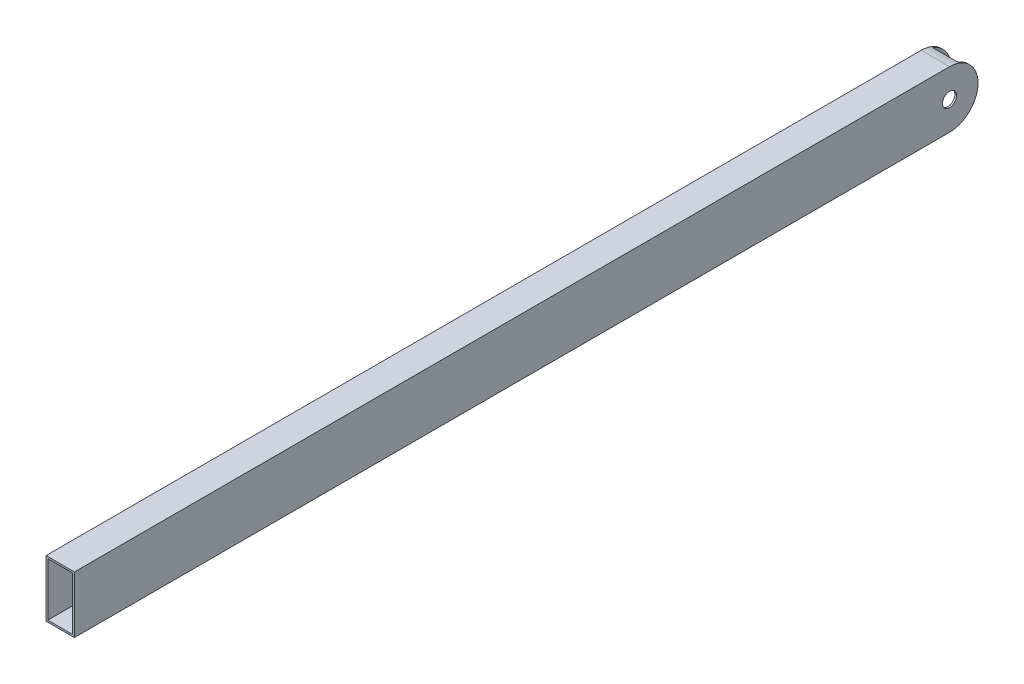
ISO-10303-21;
HEADER;
FILE_DESCRIPTION(('STEP AP214'),'2;1');
FILE_NAME('part.step','',(''),(''),'','','');
FILE_SCHEMA(('AUTOMOTIVE_DESIGN { 1 0 10303 214 1 1 1 1 }'));
ENDSEC;
DATA;
#1=APPLICATION_CONTEXT('core data for automotive mechanical design processes');
#2=APPLICATION_PROTOCOL_DEFINITION('international standard','automotive_design',2000,#1);
#3=PRODUCT_CONTEXT('',#1,'mechanical');
#4=PRODUCT('Part','Part','',(#3));
#5=PRODUCT_RELATED_PRODUCT_CATEGORY('part','',(#4));
#6=PRODUCT_DEFINITION_FORMATION('','',#4);
#7=PRODUCT_DEFINITION_CONTEXT('part definition',#1,'design');
#8=PRODUCT_DEFINITION('design','',#6,#7);
#9=PRODUCT_DEFINITION_SHAPE('','',#8);
#10=(LENGTH_UNIT() NAMED_UNIT(*) SI_UNIT(.MILLI.,.METRE.));
#11=(NAMED_UNIT(*) PLANE_ANGLE_UNIT() SI_UNIT($,.RADIAN.));
#12=(NAMED_UNIT(*) SI_UNIT($,.STERADIAN.) SOLID_ANGLE_UNIT());
#13=UNCERTAINTY_MEASURE_WITH_UNIT(LENGTH_MEASURE(1.E-05),#10,'distance_accuracy_value','');
#14=(GEOMETRIC_REPRESENTATION_CONTEXT(3) GLOBAL_UNCERTAINTY_ASSIGNED_CONTEXT((#13)) GLOBAL_UNIT_ASSIGNED_CONTEXT((#10,
#11,#12)) REPRESENTATION_CONTEXT('',''));
#15=CARTESIAN_POINT('',(0.,0.,0.));
#16=DIRECTION('',(0.,0.,1.));
#17=DIRECTION('',(1.,0.,0.));
#18=AXIS2_PLACEMENT_3D('',#15,#16,#17);
#19=CARTESIAN_POINT('',(12.7,0.,-378.46));
#20=DIRECTION('',(1.,0.,0.));
#21=DIRECTION('',(0.,0.,-1.));
#22=AXIS2_PLACEMENT_3D('',#19,#20,#21);
#23=CYLINDRICAL_SURFACE('',#22,6.35);
#24=CARTESIAN_POINT('',(-11.1125,0.,-378.46));
#25=DIRECTION('',(1.,0.,0.));
#26=DIRECTION('',(0.,0.,-1.));
#27=AXIS2_PLACEMENT_3D('',#24,#25,#26);
#28=CIRCLE('',#27,6.35);
#29=CARTESIAN_POINT('',(-11.1125,0.,-384.81));
#30=VERTEX_POINT('',#29);
#31=EDGE_CURVE('E99',#30,#30,#28,.F.);
#32=ORIENTED_EDGE('',*,*,#31,.F.);
#33=EDGE_LOOP('',(#32));
#34=FACE_BOUND('',#33,.T.);
#35=CARTESIAN_POINT('',(-12.7,0.,-378.46));
#36=DIRECTION('',(1.,0.,0.));
#37=DIRECTION('',(0.,0.,-1.));
#38=AXIS2_PLACEMENT_3D('',#35,#36,#37);
#39=CIRCLE('',#38,6.35);
#40=CARTESIAN_POINT('',(-12.7,0.,-384.81));
#41=VERTEX_POINT('',#40);
#42=EDGE_CURVE('E19',#41,#41,#39,.T.);
#43=ORIENTED_EDGE('',*,*,#42,.F.);
#44=EDGE_LOOP('',(#43));
#45=FACE_BOUND('',#44,.T.);
#46=ADVANCED_FACE('F16',(#34,#45),#23,.F.);
#47=CARTESIAN_POINT('',(-12.7,25.4,-403.86));
#48=DIRECTION('',(-1.,0.,0.));
#49=DIRECTION('',(0.,0.,1.));
#50=AXIS2_PLACEMENT_3D('',#47,#48,#49);
#51=PLANE('',#50);
#52=ORIENTED_EDGE('',*,*,#42,.T.);
#53=EDGE_LOOP('',(#52));
#54=FACE_BOUND('',#53,.T.);
#55=DIRECTION('',(0.,0.,1.));
#56=VECTOR('',#55,1.);
#57=CARTESIAN_POINT('',(-12.7,25.4,-403.86));
#58=LINE('',#57,#56);
#59=CARTESIAN_POINT('',(-12.7,25.4,-378.46));
#60=VERTEX_POINT('',#59);
#61=CARTESIAN_POINT('',(-12.7,25.4,403.86));
#62=VERTEX_POINT('',#61);
#63=EDGE_CURVE('E154',#60,#62,#58,.T.);
#64=ORIENTED_EDGE('',*,*,#63,.F.);
#65=CARTESIAN_POINT('',(-12.7,0.,-378.46));
#66=DIRECTION('',(1.,0.,0.));
#67=DIRECTION('',(0.,0.,-1.));
#68=AXIS2_PLACEMENT_3D('',#65,#66,#67);
#69=CIRCLE('',#68,25.4);
#70=CARTESIAN_POINT('',(-12.7,-25.4,-378.46));
#71=VERTEX_POINT('',#70);
#72=EDGE_CURVE('E64',#71,#60,#69,.T.);
#73=ORIENTED_EDGE('',*,*,#72,.F.);
#74=DIRECTION('',(0.,0.,-1.));
#75=VECTOR('',#74,1.);
#76=CARTESIAN_POINT('',(-12.7,-25.4,-403.86));
#77=LINE('',#76,#75);
#78=CARTESIAN_POINT('',(-12.7,-25.4,403.86));
#79=VERTEX_POINT('',#78);
#80=EDGE_CURVE('E135',#79,#71,#77,.T.);
#81=ORIENTED_EDGE('',*,*,#80,.F.);
#82=DIRECTION('',(0.,1.,0.));
#83=VECTOR('',#82,1.);
#84=CARTESIAN_POINT('',(-12.7,0.,403.86));
#85=LINE('',#84,#83);
#86=EDGE_CURVE('E71',#62,#79,#85,.F.);
#87=ORIENTED_EDGE('',*,*,#86,.F.);
#88=EDGE_LOOP('',(#64,#73,#81,#87));
#89=FACE_BOUND('',#88,.T.);
#90=ADVANCED_FACE('F286',(#54,#89),#51,.T.);
#91=CARTESIAN_POINT('',(-11.1125,23.8125,-403.86));
#92=DIRECTION('',(0.,-1.,0.));
#93=DIRECTION('',(0.,0.,-1.));
#94=AXIS2_PLACEMENT_3D('',#91,#92,#93);
#95=PLANE('',#94);
#96=DIRECTION('',(0.,0.,-1.));
#97=VECTOR('',#96,1.);
#98=CARTESIAN_POINT('',(-11.1125,23.8125,-403.86));
#99=LINE('',#98,#97);
#100=CARTESIAN_POINT('',(-11.1125,23.8124999999871,-387.298825926027));
#101=VERTEX_POINT('',#100);
#102=CARTESIAN_POINT('',(-11.1125,23.8125,403.86));
#103=VERTEX_POINT('',#102);
#104=EDGE_CURVE('E89',#101,#103,#99,.F.);
#105=ORIENTED_EDGE('',*,*,#104,.F.);
#106=DIRECTION('',(1.,0.,0.));
#107=VECTOR('',#106,1.);
#108=CARTESIAN_POINT('',(-45.81144,23.8124999999741,-387.298825926062));
#109=LINE('',#108,#107);
#110=CARTESIAN_POINT('',(11.1125,23.8124999999871,-387.298825926027));
#111=VERTEX_POINT('',#110);
#112=EDGE_CURVE('E133',#111,#101,#109,.F.);
#113=ORIENTED_EDGE('',*,*,#112,.F.);
#114=DIRECTION('',(0.,0.,1.));
#115=VECTOR('',#114,1.);
#116=CARTESIAN_POINT('',(11.1125,23.8125,-403.86));
#117=LINE('',#116,#115);
#118=CARTESIAN_POINT('',(11.1125,23.8125,403.86));
#119=VERTEX_POINT('',#118);
#120=EDGE_CURVE('E105',#119,#111,#117,.F.);
#121=ORIENTED_EDGE('',*,*,#120,.F.);
#122=DIRECTION('',(1.,0.,0.));
#123=VECTOR('',#122,1.);
#124=CARTESIAN_POINT('',(0.,23.8125,403.86));
#125=LINE('',#124,#123);
#126=EDGE_CURVE('E102',#103,#119,#125,.T.);
#127=ORIENTED_EDGE('',*,*,#126,.F.);
#128=EDGE_LOOP('',(#105,#113,#121,#127));
#129=FACE_BOUND('',#128,.T.);
#130=ADVANCED_FACE('F103',(#129),#95,.T.);
#131=CARTESIAN_POINT('',(-11.1125,-23.8125,-403.86));
#132=DIRECTION('',(1.,0.,0.));
#133=DIRECTION('',(0.,0.,-1.));
#134=AXIS2_PLACEMENT_3D('',#131,#132,#133);
#135=PLANE('',#134);
#136=ORIENTED_EDGE('',*,*,#31,.T.);
#137=EDGE_LOOP('',(#136));
#138=FACE_BOUND('',#137,.T.);
#139=DIRECTION('',(0.,0.,1.));
#140=VECTOR('',#139,1.);
#141=CARTESIAN_POINT('',(-11.1125,-23.8125,-403.86));
#142=LINE('',#141,#140);
#143=CARTESIAN_POINT('',(-11.1125,-23.8124999999871,-387.298825926027));
#144=VERTEX_POINT('',#143);
#145=CARTESIAN_POINT('',(-11.1125,-23.8125,403.86));
#146=VERTEX_POINT('',#145);
#147=EDGE_CURVE('E84',#144,#146,#142,.T.);
#148=ORIENTED_EDGE('',*,*,#147,.F.);
#149=CARTESIAN_POINT('',(-11.1125,0.,-378.46));
#150=DIRECTION('',(1.,0.,0.));
#151=DIRECTION('',(0.,0.,-1.));
#152=AXIS2_PLACEMENT_3D('',#149,#150,#151);
#153=CIRCLE('',#152,25.4);
#154=EDGE_CURVE('E96',#101,#144,#153,.F.);
#155=ORIENTED_EDGE('',*,*,#154,.F.);
#156=ORIENTED_EDGE('',*,*,#104,.T.);
#157=DIRECTION('',(0.,1.,0.));
#158=VECTOR('',#157,1.);
#159=CARTESIAN_POINT('',(-11.1125,0.,403.86));
#160=LINE('',#159,#158);
#161=EDGE_CURVE('E93',#146,#103,#160,.T.);
#162=ORIENTED_EDGE('',*,*,#161,.F.);
#163=EDGE_LOOP('',(#148,#155,#156,#162));
#164=FACE_BOUND('',#163,.T.);
#165=ADVANCED_FACE('F91',(#138,#164),#135,.T.);
#166=CARTESIAN_POINT('',(11.1125,-23.8125,-403.86));
#167=DIRECTION('',(0.,1.,0.));
#168=DIRECTION('',(0.,0.,1.));
#169=AXIS2_PLACEMENT_3D('',#166,#167,#168);
#170=PLANE('',#169);
#171=DIRECTION('',(0.,0.,1.));
#172=VECTOR('',#171,1.);
#173=CARTESIAN_POINT('',(11.1125,-23.8125,-403.86));
#174=LINE('',#173,#172);
#175=CARTESIAN_POINT('',(11.1125,-23.8124999999871,-387.298825926027));
#176=VERTEX_POINT('',#175);
#177=CARTESIAN_POINT('',(11.1125,-23.8125,403.86));
#178=VERTEX_POINT('',#177);
#179=EDGE_CURVE('E139',#176,#178,#174,.T.);
#180=ORIENTED_EDGE('',*,*,#179,.F.);
#181=DIRECTION('',(1.,0.,0.));
#182=VECTOR('',#181,1.);
#183=CARTESIAN_POINT('',(-45.81144,-23.8124999999741,-387.298825926062));
#184=LINE('',#183,#182);
#185=EDGE_CURVE('E131',#144,#176,#184,.T.);
#186=ORIENTED_EDGE('',*,*,#185,.F.);
#187=ORIENTED_EDGE('',*,*,#147,.T.);
#188=DIRECTION('',(1.,0.,0.));
#189=VECTOR('',#188,1.);
#190=CARTESIAN_POINT('',(0.,-23.8125,403.86));
#191=LINE('',#190,#189);
#192=EDGE_CURVE('E112',#178,#146,#191,.F.);
#193=ORIENTED_EDGE('',*,*,#192,.F.);
#194=EDGE_LOOP('',(#180,#186,#187,#193));
#195=FACE_BOUND('',#194,.T.);
#196=ADVANCED_FACE('F190',(#195),#170,.T.);
#197=CARTESIAN_POINT('',(11.1125,23.8125,-403.86));
#198=DIRECTION('',(-1.,0.,0.));
#199=DIRECTION('',(0.,0.,1.));
#200=AXIS2_PLACEMENT_3D('',#197,#198,#199);
#201=PLANE('',#200);
#202=CARTESIAN_POINT('',(11.1125,0.,-378.46));
#203=DIRECTION('',(1.,0.,0.));
#204=DIRECTION('',(0.,0.,-1.));
#205=AXIS2_PLACEMENT_3D('',#202,#203,#204);
#206=CIRCLE('',#205,6.35);
#207=CARTESIAN_POINT('',(11.1125,0.,-384.81));
#208=VERTEX_POINT('',#207);
#209=EDGE_CURVE('E124',#208,#208,#206,.T.);
#210=ORIENTED_EDGE('',*,*,#209,.T.);
#211=EDGE_LOOP('',(#210));
#212=FACE_BOUND('',#211,.T.);
#213=ORIENTED_EDGE('',*,*,#120,.T.);
#214=CARTESIAN_POINT('',(11.1125,0.,-378.46));
#215=DIRECTION('',(1.,0.,0.));
#216=DIRECTION('',(0.,0.,-1.));
#217=AXIS2_PLACEMENT_3D('',#214,#215,#216);
#218=CIRCLE('',#217,25.4);
#219=EDGE_CURVE('E128',#176,#111,#218,.T.);
#220=ORIENTED_EDGE('',*,*,#219,.F.);
#221=ORIENTED_EDGE('',*,*,#179,.T.);
#222=DIRECTION('',(0.,1.,0.));
#223=VECTOR('',#222,1.);
#224=CARTESIAN_POINT('',(11.1125,0.,403.86));
#225=LINE('',#224,#223);
#226=EDGE_CURVE('E109',#119,#178,#225,.F.);
#227=ORIENTED_EDGE('',*,*,#226,.F.);
#228=EDGE_LOOP('',(#213,#220,#221,#227));
#229=FACE_BOUND('',#228,.T.);
#230=ADVANCED_FACE('F192',(#212,#229),#201,.T.);
#231=CARTESIAN_POINT('',(12.7,25.4,-403.86));
#232=DIRECTION('',(0.,1.,0.));
#233=DIRECTION('',(0.,0.,1.));
#234=AXIS2_PLACEMENT_3D('',#231,#232,#233);
#235=PLANE('',#234);
#236=DIRECTION('',(0.,0.,-1.));
#237=VECTOR('',#236,1.);
#238=CARTESIAN_POINT('',(12.7,25.4,-403.86));
#239=LINE('',#238,#237);
#240=CARTESIAN_POINT('',(12.7,25.4,-378.46));
#241=VERTEX_POINT('',#240);
#242=CARTESIAN_POINT('',(12.7,25.4,403.86));
#243=VERTEX_POINT('',#242);
#244=EDGE_CURVE('E127',#241,#243,#239,.F.);
#245=ORIENTED_EDGE('',*,*,#244,.F.);
#246=DIRECTION('',(1.,0.,0.));
#247=VECTOR('',#246,1.);
#248=CARTESIAN_POINT('',(-45.81144,25.4,-378.46));
#249=LINE('',#248,#247);
#250=EDGE_CURVE('E134',#60,#241,#249,.T.);
#251=ORIENTED_EDGE('',*,*,#250,.F.);
#252=ORIENTED_EDGE('',*,*,#63,.T.);
#253=DIRECTION('',(1.,0.,0.));
#254=VECTOR('',#253,1.);
#255=CARTESIAN_POINT('',(0.,25.4,403.86));
#256=LINE('',#255,#254);
#257=EDGE_CURVE('E114',#243,#62,#256,.F.);
#258=ORIENTED_EDGE('',*,*,#257,.F.);
#259=EDGE_LOOP('',(#245,#251,#252,#258));
#260=FACE_BOUND('',#259,.T.);
#261=ADVANCED_FACE('F194',(#260),#235,.T.);
#262=CARTESIAN_POINT('',(0.,0.,403.86));
#263=DIRECTION('',(0.,0.,1.));
#264=DIRECTION('',(1.,0.,0.));
#265=AXIS2_PLACEMENT_3D('',#262,#263,#264);
#266=PLANE('',#265);
#267=ORIENTED_EDGE('',*,*,#126,.T.);
#268=ORIENTED_EDGE('',*,*,#226,.T.);
#269=ORIENTED_EDGE('',*,*,#192,.T.);
#270=ORIENTED_EDGE('',*,*,#161,.T.);
#271=EDGE_LOOP('',(#267,#268,#269,#270));
#272=FACE_BOUND('',#271,.T.);
#273=DIRECTION('',(0.,1.,0.));
#274=VECTOR('',#273,1.);
#275=CARTESIAN_POINT('',(12.7,-25.4,403.86));
#276=LINE('',#275,#274);
#277=CARTESIAN_POINT('',(12.7,-25.4,403.86));
#278=VERTEX_POINT('',#277);
#279=EDGE_CURVE('E173',#243,#278,#276,.F.);
#280=ORIENTED_EDGE('',*,*,#279,.F.);
#281=ORIENTED_EDGE('',*,*,#257,.T.);
#282=ORIENTED_EDGE('',*,*,#86,.T.);
#283=DIRECTION('',(1.,0.,0.));
#284=VECTOR('',#283,1.);
#285=CARTESIAN_POINT('',(-12.7,-25.4,403.86));
#286=LINE('',#285,#284);
#287=EDGE_CURVE('E151',#278,#79,#286,.F.);
#288=ORIENTED_EDGE('',*,*,#287,.F.);
#289=EDGE_LOOP('',(#280,#281,#282,#288));
#290=FACE_BOUND('',#289,.T.);
#291=ADVANCED_FACE('F111',(#272,#290),#266,.T.);
#292=CARTESIAN_POINT('',(-12.7,-25.4,-403.86));
#293=DIRECTION('',(0.,-1.,0.));
#294=DIRECTION('',(0.,0.,-1.));
#295=AXIS2_PLACEMENT_3D('',#292,#293,#294);
#296=PLANE('',#295);
#297=ORIENTED_EDGE('',*,*,#80,.T.);
#298=DIRECTION('',(1.,0.,0.));
#299=VECTOR('',#298,1.);
#300=CARTESIAN_POINT('',(-45.81144,-25.4,-378.46));
#301=LINE('',#300,#299);
#302=CARTESIAN_POINT('',(12.7,-25.4,-378.46));
#303=VERTEX_POINT('',#302);
#304=EDGE_CURVE('E34',#303,#71,#301,.F.);
#305=ORIENTED_EDGE('',*,*,#304,.F.);
#306=DIRECTION('',(0.,0.,-1.));
#307=VECTOR('',#306,1.);
#308=CARTESIAN_POINT('',(12.7,-25.4,-403.86));
#309=LINE('',#308,#307);
#310=EDGE_CURVE('E123',#278,#303,#309,.T.);
#311=ORIENTED_EDGE('',*,*,#310,.F.);
#312=ORIENTED_EDGE('',*,*,#287,.T.);
#313=EDGE_LOOP('',(#297,#305,#311,#312));
#314=FACE_BOUND('',#313,.T.);
#315=ADVANCED_FACE('F219',(#314),#296,.T.);
#316=CARTESIAN_POINT('',(-45.81144,0.,-378.46));
#317=DIRECTION('',(1.,0.,0.));
#318=DIRECTION('',(0.,0.,-1.));
#319=AXIS2_PLACEMENT_3D('',#316,#317,#318);
#320=CYLINDRICAL_SURFACE('',#319,25.4);
#321=ORIENTED_EDGE('',*,*,#185,.T.);
#322=ORIENTED_EDGE('',*,*,#219,.T.);
#323=ORIENTED_EDGE('',*,*,#112,.T.);
#324=ORIENTED_EDGE('',*,*,#154,.T.);
#325=EDGE_LOOP('',(#321,#322,#323,#324));
#326=FACE_BOUND('',#325,.T.);
#327=CARTESIAN_POINT('',(12.7,0.,-378.46));
#328=DIRECTION('',(1.,0.,0.));
#329=DIRECTION('',(0.,0.,-1.));
#330=AXIS2_PLACEMENT_3D('',#327,#328,#329);
#331=CIRCLE('',#330,25.4);
#332=EDGE_CURVE('E25',#303,#241,#331,.T.);
#333=ORIENTED_EDGE('',*,*,#332,.F.);
#334=ORIENTED_EDGE('',*,*,#304,.T.);
#335=ORIENTED_EDGE('',*,*,#72,.T.);
#336=ORIENTED_EDGE('',*,*,#250,.T.);
#337=EDGE_LOOP('',(#333,#334,#335,#336));
#338=FACE_BOUND('',#337,.T.);
#339=ADVANCED_FACE('F187',(#326,#338),#320,.T.);
#340=CARTESIAN_POINT('',(12.7,0.,-378.46));
#341=DIRECTION('',(1.,0.,0.));
#342=DIRECTION('',(0.,0.,-1.));
#343=AXIS2_PLACEMENT_3D('',#340,#341,#342);
#344=CYLINDRICAL_SURFACE('',#343,6.35);
#345=ORIENTED_EDGE('',*,*,#209,.F.);
#346=EDGE_LOOP('',(#345));
#347=FACE_BOUND('',#346,.T.);
#348=CARTESIAN_POINT('',(12.7,0.,-378.46));
#349=DIRECTION('',(1.,0.,0.));
#350=DIRECTION('',(0.,0.,-1.));
#351=AXIS2_PLACEMENT_3D('',#348,#349,#350);
#352=CIRCLE('',#351,6.35);
#353=CARTESIAN_POINT('',(12.7,0.,-384.81));
#354=VERTEX_POINT('',#353);
#355=EDGE_CURVE('E11',#354,#354,#352,.F.);
#356=ORIENTED_EDGE('',*,*,#355,.F.);
#357=EDGE_LOOP('',(#356));
#358=FACE_BOUND('',#357,.T.);
#359=ADVANCED_FACE('F207',(#347,#358),#344,.F.);
#360=CARTESIAN_POINT('',(12.7,-25.4,-403.86));
#361=DIRECTION('',(1.,0.,0.));
#362=DIRECTION('',(0.,0.,-1.));
#363=AXIS2_PLACEMENT_3D('',#360,#361,#362);
#364=PLANE('',#363);
#365=ORIENTED_EDGE('',*,*,#355,.T.);
#366=EDGE_LOOP('',(#365));
#367=FACE_BOUND('',#366,.T.);
#368=ORIENTED_EDGE('',*,*,#310,.T.);
#369=ORIENTED_EDGE('',*,*,#332,.T.);
#370=ORIENTED_EDGE('',*,*,#244,.T.);
#371=ORIENTED_EDGE('',*,*,#279,.T.);
#372=EDGE_LOOP('',(#368,#369,#370,#371));
#373=FACE_BOUND('',#372,.T.);
#374=ADVANCED_FACE('F205',(#367,#373),#364,.T.);
#375=CLOSED_SHELL('',(#46,#90,#130,#165,#196,#230,#261,#291,#315,#339,#359,#374));
#376=MANIFOLD_SOLID_BREP('B1',#375);
#377=ADVANCED_BREP_SHAPE_REPRESENTATION('',(#18,#376),#14);
#378=SHAPE_DEFINITION_REPRESENTATION(#9,#377);
ENDSEC;
END-ISO-10303-21;
